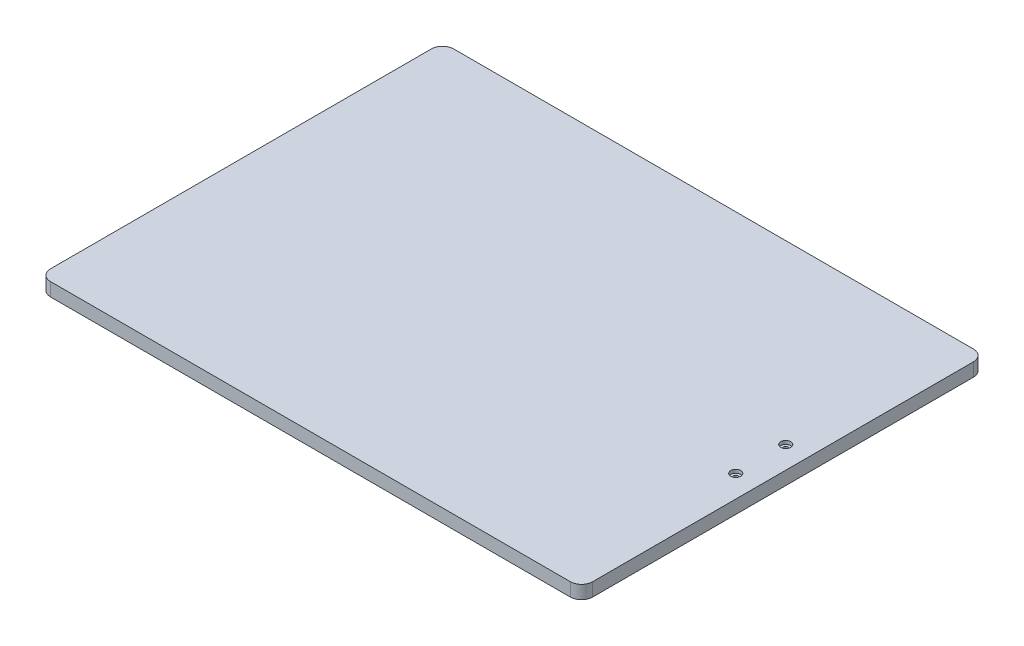
ISO-10303-21;
HEADER;
FILE_DESCRIPTION(('STEP AP214'),'2;1');
FILE_NAME('part.step','',(''),(''),'','','');
FILE_SCHEMA(('AUTOMOTIVE_DESIGN { 1 0 10303 214 1 1 1 1 }'));
ENDSEC;
DATA;
#1=APPLICATION_CONTEXT('core data for automotive mechanical design processes');
#2=APPLICATION_PROTOCOL_DEFINITION('international standard','automotive_design',2000,#1);
#3=PRODUCT_CONTEXT('',#1,'mechanical');
#4=PRODUCT('Part','Part','',(#3));
#5=PRODUCT_RELATED_PRODUCT_CATEGORY('part','',(#4));
#6=PRODUCT_DEFINITION_FORMATION('','',#4);
#7=PRODUCT_DEFINITION_CONTEXT('part definition',#1,'design');
#8=PRODUCT_DEFINITION('design','',#6,#7);
#9=PRODUCT_DEFINITION_SHAPE('','',#8);
#10=(LENGTH_UNIT() NAMED_UNIT(*) SI_UNIT(.MILLI.,.METRE.));
#11=(NAMED_UNIT(*) PLANE_ANGLE_UNIT() SI_UNIT($,.RADIAN.));
#12=(NAMED_UNIT(*) SI_UNIT($,.STERADIAN.) SOLID_ANGLE_UNIT());
#13=UNCERTAINTY_MEASURE_WITH_UNIT(LENGTH_MEASURE(1.E-05),#10,'distance_accuracy_value','');
#14=(GEOMETRIC_REPRESENTATION_CONTEXT(3) GLOBAL_UNCERTAINTY_ASSIGNED_CONTEXT((#13)) GLOBAL_UNIT_ASSIGNED_CONTEXT((#10,
#11,#12)) REPRESENTATION_CONTEXT('',''));
#15=CARTESIAN_POINT('',(0.,0.,0.));
#16=DIRECTION('',(0.,0.,1.));
#17=DIRECTION('',(1.,0.,0.));
#18=AXIS2_PLACEMENT_3D('',#15,#16,#17);
#19=CARTESIAN_POINT('',(243.75,12.,181.25));
#20=DIRECTION('',(-1.,0.,0.));
#21=DIRECTION('',(0.,0.,1.));
#22=AXIS2_PLACEMENT_3D('',#19,#20,#21);
#23=PLANE('',#22);
#24=DIRECTION('',(0.,0.,-1.));
#25=VECTOR('',#24,1.);
#26=CARTESIAN_POINT('',(243.75,12.,181.25));
#27=LINE('',#26,#25);
#28=CARTESIAN_POINT('',(243.75,12.,171.25));
#29=VERTEX_POINT('',#28);
#30=CARTESIAN_POINT('',(243.75,12.,-171.25));
#31=VERTEX_POINT('',#30);
#32=EDGE_CURVE('E126',#29,#31,#27,.T.);
#33=ORIENTED_EDGE('',*,*,#32,.F.);
#34=DIRECTION('',(0.,-1.,0.));
#35=VECTOR('',#34,1.);
#36=CARTESIAN_POINT('',(243.75,12.,171.25));
#37=LINE('',#36,#35);
#38=CARTESIAN_POINT('',(243.75,0.,171.25));
#39=VERTEX_POINT('',#38);
#40=EDGE_CURVE('E110',#29,#39,#37,.T.);
#41=ORIENTED_EDGE('',*,*,#40,.T.);
#42=DIRECTION('',(0.,0.,-1.));
#43=VECTOR('',#42,1.);
#44=CARTESIAN_POINT('',(243.75,0.,181.25));
#45=LINE('',#44,#43);
#46=CARTESIAN_POINT('',(243.75,0.,-171.25));
#47=VERTEX_POINT('',#46);
#48=EDGE_CURVE('E123',#39,#47,#45,.T.);
#49=ORIENTED_EDGE('',*,*,#48,.T.);
#50=DIRECTION('',(0.,-1.,0.));
#51=VECTOR('',#50,1.);
#52=CARTESIAN_POINT('',(243.75,12.,-171.25));
#53=LINE('',#52,#51);
#54=EDGE_CURVE('E129',#47,#31,#53,.F.);
#55=ORIENTED_EDGE('',*,*,#54,.T.);
#56=EDGE_LOOP('',(#33,#41,#49,#55));
#57=FACE_BOUND('',#56,.T.);
#58=ADVANCED_FACE('F39',(#57),#23,.F.);
#59=CARTESIAN_POINT('',(-243.75,12.,-181.25));
#60=DIRECTION('',(0.,0.,1.));
#61=DIRECTION('',(1.,0.,0.));
#62=AXIS2_PLACEMENT_3D('',#59,#60,#61);
#63=PLANE('',#62);
#64=DIRECTION('',(-1.,0.,0.));
#65=VECTOR('',#64,1.);
#66=CARTESIAN_POINT('',(-243.75,0.,-181.25));
#67=LINE('',#66,#65);
#68=CARTESIAN_POINT('',(233.75,0.,-181.25));
#69=VERTEX_POINT('',#68);
#70=CARTESIAN_POINT('',(-233.75,0.,-181.25));
#71=VERTEX_POINT('',#70);
#72=EDGE_CURVE('E135',#69,#71,#67,.T.);
#73=ORIENTED_EDGE('',*,*,#72,.T.);
#74=DIRECTION('',(0.,-1.,0.));
#75=VECTOR('',#74,1.);
#76=CARTESIAN_POINT('',(-233.75,12.,-181.25));
#77=LINE('',#76,#75);
#78=CARTESIAN_POINT('',(-233.75,12.,-181.25));
#79=VERTEX_POINT('',#78);
#80=EDGE_CURVE('E11',#71,#79,#77,.F.);
#81=ORIENTED_EDGE('',*,*,#80,.T.);
#82=DIRECTION('',(-1.,0.,0.));
#83=VECTOR('',#82,1.);
#84=CARTESIAN_POINT('',(-243.75,12.,-181.25));
#85=LINE('',#84,#83);
#86=CARTESIAN_POINT('',(233.75,12.,-181.25));
#87=VERTEX_POINT('',#86);
#88=EDGE_CURVE('E191',#87,#79,#85,.T.);
#89=ORIENTED_EDGE('',*,*,#88,.F.);
#90=DIRECTION('',(0.,-1.,0.));
#91=VECTOR('',#90,1.);
#92=CARTESIAN_POINT('',(233.75,12.,-181.25));
#93=LINE('',#92,#91);
#94=EDGE_CURVE('E48',#87,#69,#93,.T.);
#95=ORIENTED_EDGE('',*,*,#94,.T.);
#96=EDGE_LOOP('',(#73,#81,#89,#95));
#97=FACE_BOUND('',#96,.T.);
#98=ADVANCED_FACE('F189',(#97),#63,.F.);
#99=CARTESIAN_POINT('',(-243.75,12.,181.25));
#100=DIRECTION('',(1.,0.,0.));
#101=DIRECTION('',(0.,0.,-1.));
#102=AXIS2_PLACEMENT_3D('',#99,#100,#101);
#103=PLANE('',#102);
#104=DIRECTION('',(0.,0.,1.));
#105=VECTOR('',#104,1.);
#106=CARTESIAN_POINT('',(-243.75,12.,181.25));
#107=LINE('',#106,#105);
#108=CARTESIAN_POINT('',(-243.75,12.,-171.25));
#109=VERTEX_POINT('',#108);
#110=CARTESIAN_POINT('',(-243.75,12.,171.25));
#111=VERTEX_POINT('',#110);
#112=EDGE_CURVE('E199',#109,#111,#107,.T.);
#113=ORIENTED_EDGE('',*,*,#112,.F.);
#114=DIRECTION('',(0.,-1.,0.));
#115=VECTOR('',#114,1.);
#116=CARTESIAN_POINT('',(-243.75,12.,-171.25));
#117=LINE('',#116,#115);
#118=CARTESIAN_POINT('',(-243.75,0.,-171.25));
#119=VERTEX_POINT('',#118);
#120=EDGE_CURVE('E181',#109,#119,#117,.T.);
#121=ORIENTED_EDGE('',*,*,#120,.T.);
#122=DIRECTION('',(0.,0.,1.));
#123=VECTOR('',#122,1.);
#124=CARTESIAN_POINT('',(-243.75,0.,181.25));
#125=LINE('',#124,#123);
#126=CARTESIAN_POINT('',(-243.75,0.,171.25));
#127=VERTEX_POINT('',#126);
#128=EDGE_CURVE('E141',#119,#127,#125,.T.);
#129=ORIENTED_EDGE('',*,*,#128,.T.);
#130=DIRECTION('',(0.,-1.,0.));
#131=VECTOR('',#130,1.);
#132=CARTESIAN_POINT('',(-243.75,12.,171.25));
#133=LINE('',#132,#131);
#134=EDGE_CURVE('E55',#127,#111,#133,.F.);
#135=ORIENTED_EDGE('',*,*,#134,.T.);
#136=EDGE_LOOP('',(#113,#121,#129,#135));
#137=FACE_BOUND('',#136,.T.);
#138=ADVANCED_FACE('F198',(#137),#103,.F.);
#139=CARTESIAN_POINT('',(-243.75,12.,181.25));
#140=DIRECTION('',(0.,0.,-1.));
#141=DIRECTION('',(-1.,0.,0.));
#142=AXIS2_PLACEMENT_3D('',#139,#140,#141);
#143=PLANE('',#142);
#144=DIRECTION('',(1.,0.,0.));
#145=VECTOR('',#144,1.);
#146=CARTESIAN_POINT('',(-243.75,0.,181.25));
#147=LINE('',#146,#145);
#148=CARTESIAN_POINT('',(-233.75,0.,181.25));
#149=VERTEX_POINT('',#148);
#150=CARTESIAN_POINT('',(233.75,0.,181.25));
#151=VERTEX_POINT('',#150);
#152=EDGE_CURVE('E152',#149,#151,#147,.T.);
#153=ORIENTED_EDGE('',*,*,#152,.T.);
#154=DIRECTION('',(0.,-1.,0.));
#155=VECTOR('',#154,1.);
#156=CARTESIAN_POINT('',(233.75,12.,181.25));
#157=LINE('',#156,#155);
#158=CARTESIAN_POINT('',(233.75,12.,181.25));
#159=VERTEX_POINT('',#158);
#160=EDGE_CURVE('E111',#151,#159,#157,.F.);
#161=ORIENTED_EDGE('',*,*,#160,.T.);
#162=DIRECTION('',(1.,0.,0.));
#163=VECTOR('',#162,1.);
#164=CARTESIAN_POINT('',(-243.75,12.,181.25));
#165=LINE('',#164,#163);
#166=CARTESIAN_POINT('',(-233.75,12.,181.25));
#167=VERTEX_POINT('',#166);
#168=EDGE_CURVE('E147',#167,#159,#165,.T.);
#169=ORIENTED_EDGE('',*,*,#168,.F.);
#170=DIRECTION('',(0.,-1.,0.));
#171=VECTOR('',#170,1.);
#172=CARTESIAN_POINT('',(-233.75,12.,181.25));
#173=LINE('',#172,#171);
#174=EDGE_CURVE('E117',#167,#149,#173,.T.);
#175=ORIENTED_EDGE('',*,*,#174,.T.);
#176=EDGE_LOOP('',(#153,#161,#169,#175));
#177=FACE_BOUND('',#176,.T.);
#178=ADVANCED_FACE('F242',(#177),#143,.F.);
#179=CARTESIAN_POINT('',(0.,12.,0.));
#180=DIRECTION('',(0.,-1.,0.));
#181=DIRECTION('',(0.,0.,-1.));
#182=AXIS2_PLACEMENT_3D('',#179,#180,#181);
#183=PLANE('',#182);
#184=CARTESIAN_POINT('',(223.75,12.,22.5));
#185=DIRECTION('',(0.,1.,0.));
#186=DIRECTION('',(0.,0.,1.));
#187=AXIS2_PLACEMENT_3D('',#184,#185,#186);
#188=CIRCLE('',#187,4.5);
#189=CARTESIAN_POINT('',(223.75,12.,27.));
#190=VERTEX_POINT('',#189);
#191=EDGE_CURVE('E232',#190,#190,#188,.T.);
#192=ORIENTED_EDGE('',*,*,#191,.F.);
#193=EDGE_LOOP('',(#192));
#194=FACE_BOUND('',#193,.T.);
#195=CARTESIAN_POINT('',(223.75,12.,-22.5));
#196=DIRECTION('',(0.,1.,0.));
#197=DIRECTION('',(0.,0.,1.));
#198=AXIS2_PLACEMENT_3D('',#195,#196,#197);
#199=CIRCLE('',#198,4.5);
#200=CARTESIAN_POINT('',(223.75,12.,-18.));
#201=VERTEX_POINT('',#200);
#202=EDGE_CURVE('E216',#201,#201,#199,.T.);
#203=ORIENTED_EDGE('',*,*,#202,.F.);
#204=EDGE_LOOP('',(#203));
#205=FACE_BOUND('',#204,.T.);
#206=ORIENTED_EDGE('',*,*,#168,.T.);
#207=CARTESIAN_POINT('',(233.75,12.,171.25));
#208=DIRECTION('',(0.,-1.,0.));
#209=DIRECTION('',(0.,0.,-1.));
#210=AXIS2_PLACEMENT_3D('',#207,#208,#209);
#211=CIRCLE('',#210,10.);
#212=EDGE_CURVE('E176',#159,#29,#211,.F.);
#213=ORIENTED_EDGE('',*,*,#212,.T.);
#214=ORIENTED_EDGE('',*,*,#32,.T.);
#215=CARTESIAN_POINT('',(233.75,12.,-171.25));
#216=DIRECTION('',(0.,-1.,0.));
#217=DIRECTION('',(0.,0.,-1.));
#218=AXIS2_PLACEMENT_3D('',#215,#216,#217);
#219=CIRCLE('',#218,10.);
#220=EDGE_CURVE('E171',#31,#87,#219,.F.);
#221=ORIENTED_EDGE('',*,*,#220,.T.);
#222=ORIENTED_EDGE('',*,*,#88,.T.);
#223=CARTESIAN_POINT('',(-233.75,12.,-171.25));
#224=DIRECTION('',(0.,-1.,0.));
#225=DIRECTION('',(0.,0.,-1.));
#226=AXIS2_PLACEMENT_3D('',#223,#224,#225);
#227=CIRCLE('',#226,10.);
#228=EDGE_CURVE('E62',#79,#109,#227,.F.);
#229=ORIENTED_EDGE('',*,*,#228,.T.);
#230=ORIENTED_EDGE('',*,*,#112,.T.);
#231=CARTESIAN_POINT('',(-233.75,12.,171.25));
#232=DIRECTION('',(0.,-1.,0.));
#233=DIRECTION('',(0.,0.,-1.));
#234=AXIS2_PLACEMENT_3D('',#231,#232,#233);
#235=CIRCLE('',#234,10.);
#236=EDGE_CURVE('E168',#111,#167,#235,.F.);
#237=ORIENTED_EDGE('',*,*,#236,.T.);
#238=EDGE_LOOP('',(#206,#213,#214,#221,#222,#229,#230,#237));
#239=FACE_BOUND('',#238,.T.);
#240=ADVANCED_FACE('F239',(#194,#205,#239),#183,.F.);
#241=CARTESIAN_POINT('',(0.,0.,0.));
#242=DIRECTION('',(0.,-1.,0.));
#243=DIRECTION('',(0.,0.,-1.));
#244=AXIS2_PLACEMENT_3D('',#241,#242,#243);
#245=PLANE('',#244);
#246=CARTESIAN_POINT('',(223.75,0.,22.5));
#247=DIRECTION('',(0.,1.,0.));
#248=DIRECTION('',(0.,0.,1.));
#249=AXIS2_PLACEMENT_3D('',#246,#247,#248);
#250=CIRCLE('',#249,2.25);
#251=CARTESIAN_POINT('',(223.75,0.,24.75));
#252=VERTEX_POINT('',#251);
#253=EDGE_CURVE('E220',#252,#252,#250,.T.);
#254=ORIENTED_EDGE('',*,*,#253,.T.);
#255=EDGE_LOOP('',(#254));
#256=FACE_BOUND('',#255,.T.);
#257=CARTESIAN_POINT('',(223.75,0.,-22.5));
#258=DIRECTION('',(0.,1.,0.));
#259=DIRECTION('',(0.,0.,1.));
#260=AXIS2_PLACEMENT_3D('',#257,#258,#259);
#261=CIRCLE('',#260,2.25);
#262=CARTESIAN_POINT('',(223.75,0.,-20.25));
#263=VERTEX_POINT('',#262);
#264=EDGE_CURVE('E136',#263,#263,#261,.T.);
#265=ORIENTED_EDGE('',*,*,#264,.T.);
#266=EDGE_LOOP('',(#265));
#267=FACE_BOUND('',#266,.T.);
#268=ORIENTED_EDGE('',*,*,#48,.F.);
#269=CARTESIAN_POINT('',(233.75,0.,171.25));
#270=DIRECTION('',(0.,-1.,0.));
#271=DIRECTION('',(0.,0.,-1.));
#272=AXIS2_PLACEMENT_3D('',#269,#270,#271);
#273=CIRCLE('',#272,10.);
#274=EDGE_CURVE('E106',#39,#151,#273,.T.);
#275=ORIENTED_EDGE('',*,*,#274,.T.);
#276=ORIENTED_EDGE('',*,*,#152,.F.);
#277=CARTESIAN_POINT('',(-233.75,0.,171.25));
#278=DIRECTION('',(0.,-1.,0.));
#279=DIRECTION('',(0.,0.,-1.));
#280=AXIS2_PLACEMENT_3D('',#277,#278,#279);
#281=CIRCLE('',#280,10.);
#282=EDGE_CURVE('E128',#149,#127,#281,.T.);
#283=ORIENTED_EDGE('',*,*,#282,.T.);
#284=ORIENTED_EDGE('',*,*,#128,.F.);
#285=CARTESIAN_POINT('',(-233.75,0.,-171.25));
#286=DIRECTION('',(0.,-1.,0.));
#287=DIRECTION('',(0.,0.,-1.));
#288=AXIS2_PLACEMENT_3D('',#285,#286,#287);
#289=CIRCLE('',#288,10.);
#290=EDGE_CURVE('E118',#119,#71,#289,.T.);
#291=ORIENTED_EDGE('',*,*,#290,.T.);
#292=ORIENTED_EDGE('',*,*,#72,.F.);
#293=CARTESIAN_POINT('',(233.75,0.,-171.25));
#294=DIRECTION('',(0.,-1.,0.));
#295=DIRECTION('',(0.,0.,-1.));
#296=AXIS2_PLACEMENT_3D('',#293,#294,#295);
#297=CIRCLE('',#296,10.);
#298=EDGE_CURVE('E133',#69,#47,#297,.T.);
#299=ORIENTED_EDGE('',*,*,#298,.T.);
#300=EDGE_LOOP('',(#268,#275,#276,#283,#284,#291,#292,#299));
#301=FACE_BOUND('',#300,.T.);
#302=ADVANCED_FACE('F131',(#256,#267,#301),#245,.T.);
#303=CARTESIAN_POINT('',(233.75,12.,171.25));
#304=DIRECTION('',(0.,-1.,0.));
#305=DIRECTION('',(0.,0.,-1.));
#306=AXIS2_PLACEMENT_3D('',#303,#304,#305);
#307=CYLINDRICAL_SURFACE('',#306,10.);
#308=ORIENTED_EDGE('',*,*,#212,.F.);
#309=ORIENTED_EDGE('',*,*,#160,.F.);
#310=ORIENTED_EDGE('',*,*,#274,.F.);
#311=ORIENTED_EDGE('',*,*,#40,.F.);
#312=EDGE_LOOP('',(#308,#309,#310,#311));
#313=FACE_BOUND('',#312,.T.);
#314=ADVANCED_FACE('F109',(#313),#307,.T.);
#315=CARTESIAN_POINT('',(-233.75,12.,-171.25));
#316=DIRECTION('',(0.,-1.,0.));
#317=DIRECTION('',(0.,0.,-1.));
#318=AXIS2_PLACEMENT_3D('',#315,#316,#317);
#319=CYLINDRICAL_SURFACE('',#318,10.);
#320=ORIENTED_EDGE('',*,*,#228,.F.);
#321=ORIENTED_EDGE('',*,*,#80,.F.);
#322=ORIENTED_EDGE('',*,*,#290,.F.);
#323=ORIENTED_EDGE('',*,*,#120,.F.);
#324=EDGE_LOOP('',(#320,#321,#322,#323));
#325=FACE_BOUND('',#324,.T.);
#326=ADVANCED_FACE('F197',(#325),#319,.T.);
#327=CARTESIAN_POINT('',(233.75,12.,-171.25));
#328=DIRECTION('',(0.,-1.,0.));
#329=DIRECTION('',(0.,0.,-1.));
#330=AXIS2_PLACEMENT_3D('',#327,#328,#329);
#331=CYLINDRICAL_SURFACE('',#330,10.);
#332=ORIENTED_EDGE('',*,*,#220,.F.);
#333=ORIENTED_EDGE('',*,*,#54,.F.);
#334=ORIENTED_EDGE('',*,*,#298,.F.);
#335=ORIENTED_EDGE('',*,*,#94,.F.);
#336=EDGE_LOOP('',(#332,#333,#334,#335));
#337=FACE_BOUND('',#336,.T.);
#338=ADVANCED_FACE('F251',(#337),#331,.T.);
#339=CARTESIAN_POINT('',(-233.75,12.,171.25));
#340=DIRECTION('',(0.,-1.,0.));
#341=DIRECTION('',(0.,0.,-1.));
#342=AXIS2_PLACEMENT_3D('',#339,#340,#341);
#343=CYLINDRICAL_SURFACE('',#342,10.);
#344=ORIENTED_EDGE('',*,*,#236,.F.);
#345=ORIENTED_EDGE('',*,*,#134,.F.);
#346=ORIENTED_EDGE('',*,*,#282,.F.);
#347=ORIENTED_EDGE('',*,*,#174,.F.);
#348=EDGE_LOOP('',(#344,#345,#346,#347));
#349=FACE_BOUND('',#348,.T.);
#350=ADVANCED_FACE('F41',(#349),#343,.T.);
#351=CARTESIAN_POINT('',(223.75,12.,-22.5));
#352=DIRECTION('',(0.,1.,0.));
#353=DIRECTION('',(0.,0.,1.));
#354=AXIS2_PLACEMENT_3D('',#351,#352,#353);
#355=CYLINDRICAL_SURFACE('',#354,2.25);
#356=ORIENTED_EDGE('',*,*,#264,.F.);
#357=EDGE_LOOP('',(#356));
#358=FACE_BOUND('',#357,.T.);
#359=CARTESIAN_POINT('',(223.75,8.9,-22.5));
#360=DIRECTION('',(0.,1.,0.));
#361=DIRECTION('',(0.,0.,1.));
#362=AXIS2_PLACEMENT_3D('',#359,#360,#361);
#363=CIRCLE('',#362,2.25);
#364=CARTESIAN_POINT('',(223.75,8.9,-20.25));
#365=VERTEX_POINT('',#364);
#366=EDGE_CURVE('E144',#365,#365,#363,.T.);
#367=ORIENTED_EDGE('',*,*,#366,.T.);
#368=EDGE_LOOP('',(#367));
#369=FACE_BOUND('',#368,.T.);
#370=ADVANCED_FACE('F250',(#358,#369),#355,.F.);
#371=CARTESIAN_POINT('',(226.,8.9,-22.5));
#372=DIRECTION('',(0.,-1.,0.));
#373=DIRECTION('',(0.,0.,-1.));
#374=AXIS2_PLACEMENT_3D('',#371,#372,#373);
#375=PLANE('',#374);
#376=ORIENTED_EDGE('',*,*,#366,.F.);
#377=EDGE_LOOP('',(#376));
#378=FACE_BOUND('',#377,.T.);
#379=CARTESIAN_POINT('',(223.75,8.9,-22.5));
#380=DIRECTION('',(0.,1.,0.));
#381=DIRECTION('',(0.,0.,1.));
#382=AXIS2_PLACEMENT_3D('',#379,#380,#381);
#383=CIRCLE('',#382,4.5);
#384=CARTESIAN_POINT('',(223.75,8.9,-18.));
#385=VERTEX_POINT('',#384);
#386=EDGE_CURVE('E212',#385,#385,#383,.T.);
#387=ORIENTED_EDGE('',*,*,#386,.T.);
#388=EDGE_LOOP('',(#387));
#389=FACE_BOUND('',#388,.T.);
#390=ADVANCED_FACE('F256',(#378,#389),#375,.F.);
#391=CARTESIAN_POINT('',(223.75,12.,-22.5));
#392=DIRECTION('',(0.,1.,0.));
#393=DIRECTION('',(0.,0.,1.));
#394=AXIS2_PLACEMENT_3D('',#391,#392,#393);
#395=CYLINDRICAL_SURFACE('',#394,4.5);
#396=ORIENTED_EDGE('',*,*,#386,.F.);
#397=EDGE_LOOP('',(#396));
#398=FACE_BOUND('',#397,.T.);
#399=ORIENTED_EDGE('',*,*,#202,.T.);
#400=EDGE_LOOP('',(#399));
#401=FACE_BOUND('',#400,.T.);
#402=ADVANCED_FACE('F315',(#398,#401),#395,.F.);
#403=CARTESIAN_POINT('',(223.75,12.,22.5));
#404=DIRECTION('',(0.,1.,0.));
#405=DIRECTION('',(0.,0.,1.));
#406=AXIS2_PLACEMENT_3D('',#403,#404,#405);
#407=CYLINDRICAL_SURFACE('',#406,2.25);
#408=ORIENTED_EDGE('',*,*,#253,.F.);
#409=EDGE_LOOP('',(#408));
#410=FACE_BOUND('',#409,.T.);
#411=CARTESIAN_POINT('',(223.75,8.9,22.5));
#412=DIRECTION('',(0.,1.,0.));
#413=DIRECTION('',(0.,0.,1.));
#414=AXIS2_PLACEMENT_3D('',#411,#412,#413);
#415=CIRCLE('',#414,2.25);
#416=CARTESIAN_POINT('',(223.75,8.9,24.75));
#417=VERTEX_POINT('',#416);
#418=EDGE_CURVE('E224',#417,#417,#415,.T.);
#419=ORIENTED_EDGE('',*,*,#418,.T.);
#420=EDGE_LOOP('',(#419));
#421=FACE_BOUND('',#420,.T.);
#422=ADVANCED_FACE('F325',(#410,#421),#407,.F.);
#423=CARTESIAN_POINT('',(226.,8.9,22.5));
#424=DIRECTION('',(0.,-1.,0.));
#425=DIRECTION('',(0.,0.,-1.));
#426=AXIS2_PLACEMENT_3D('',#423,#424,#425);
#427=PLANE('',#426);
#428=ORIENTED_EDGE('',*,*,#418,.F.);
#429=EDGE_LOOP('',(#428));
#430=FACE_BOUND('',#429,.T.);
#431=CARTESIAN_POINT('',(223.75,8.9,22.5));
#432=DIRECTION('',(0.,1.,0.));
#433=DIRECTION('',(0.,0.,1.));
#434=AXIS2_PLACEMENT_3D('',#431,#432,#433);
#435=CIRCLE('',#434,4.5);
#436=CARTESIAN_POINT('',(223.75,8.9,27.));
#437=VERTEX_POINT('',#436);
#438=EDGE_CURVE('E228',#437,#437,#435,.T.);
#439=ORIENTED_EDGE('',*,*,#438,.T.);
#440=EDGE_LOOP('',(#439));
#441=FACE_BOUND('',#440,.T.);
#442=ADVANCED_FACE('F335',(#430,#441),#427,.F.);
#443=CARTESIAN_POINT('',(223.75,12.,22.5));
#444=DIRECTION('',(0.,1.,0.));
#445=DIRECTION('',(0.,0.,1.));
#446=AXIS2_PLACEMENT_3D('',#443,#444,#445);
#447=CYLINDRICAL_SURFACE('',#446,4.5);
#448=ORIENTED_EDGE('',*,*,#438,.F.);
#449=EDGE_LOOP('',(#448));
#450=FACE_BOUND('',#449,.T.);
#451=ORIENTED_EDGE('',*,*,#191,.T.);
#452=EDGE_LOOP('',(#451));
#453=FACE_BOUND('',#452,.T.);
#454=ADVANCED_FACE('F237',(#450,#453),#447,.F.);
#455=CLOSED_SHELL('',(#58,#98,#138,#178,#240,#302,#314,#326,#338,#350,#370,#390,#402,#422,#442,#454));
#456=MANIFOLD_SOLID_BREP('B2',#455);
#457=ADVANCED_BREP_SHAPE_REPRESENTATION('',(#18,#456),#14);
#458=SHAPE_DEFINITION_REPRESENTATION(#9,#457);
ENDSEC;
END-ISO-10303-21;
